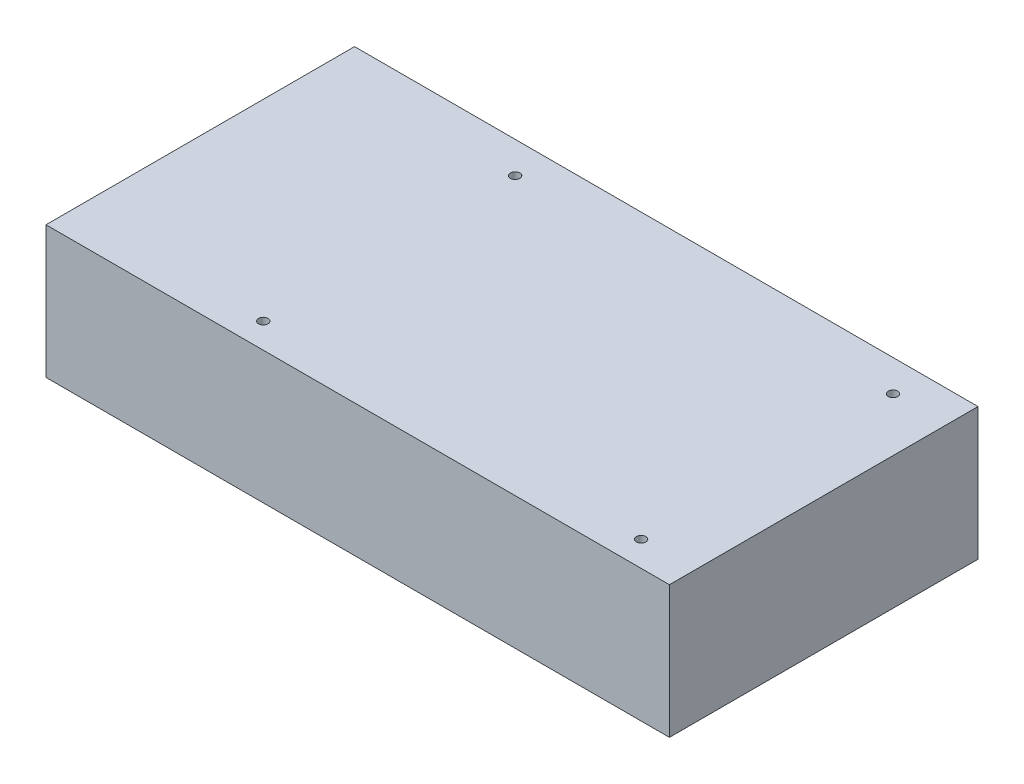
ISO-10303-21;
HEADER;
FILE_DESCRIPTION(('STEP AP214'),'2;1');
FILE_NAME('part.step','',(''),(''),'','','');
FILE_SCHEMA(('AUTOMOTIVE_DESIGN { 1 0 10303 214 1 1 1 1 }'));
ENDSEC;
DATA;
#1=APPLICATION_CONTEXT('core data for automotive mechanical design processes');
#2=APPLICATION_PROTOCOL_DEFINITION('international standard','automotive_design',2000,#1);
#3=PRODUCT_CONTEXT('',#1,'mechanical');
#4=PRODUCT('Part','Part','',(#3));
#5=PRODUCT_RELATED_PRODUCT_CATEGORY('part','',(#4));
#6=PRODUCT_DEFINITION_FORMATION('','',#4);
#7=PRODUCT_DEFINITION_CONTEXT('part definition',#1,'design');
#8=PRODUCT_DEFINITION('design','',#6,#7);
#9=PRODUCT_DEFINITION_SHAPE('','',#8);
#10=(LENGTH_UNIT() NAMED_UNIT(*) SI_UNIT(.MILLI.,.METRE.));
#11=(NAMED_UNIT(*) PLANE_ANGLE_UNIT() SI_UNIT($,.RADIAN.));
#12=(NAMED_UNIT(*) SI_UNIT($,.STERADIAN.) SOLID_ANGLE_UNIT());
#13=UNCERTAINTY_MEASURE_WITH_UNIT(LENGTH_MEASURE(1.E-05),#10,'distance_accuracy_value','');
#14=(GEOMETRIC_REPRESENTATION_CONTEXT(3) GLOBAL_UNCERTAINTY_ASSIGNED_CONTEXT((#13)) GLOBAL_UNIT_ASSIGNED_CONTEXT((#10,
#11,#12)) REPRESENTATION_CONTEXT('',''));
#15=CARTESIAN_POINT('',(0.,0.,0.));
#16=DIRECTION('',(0.,0.,1.));
#17=DIRECTION('',(1.,0.,0.));
#18=AXIS2_PLACEMENT_3D('',#15,#16,#17);
#19=CARTESIAN_POINT('',(0.,42.,0.));
#20=DIRECTION('',(1.,0.,0.));
#21=DIRECTION('',(0.,0.,-1.));
#22=AXIS2_PLACEMENT_3D('',#19,#20,#21);
#23=PLANE('',#22);
#24=DIRECTION('',(0.,0.,1.));
#25=VECTOR('',#24,1.);
#26=CARTESIAN_POINT('',(0.,0.,0.));
#27=LINE('',#26,#25);
#28=CARTESIAN_POINT('',(0.,0.,0.));
#29=VERTEX_POINT('',#28);
#30=CARTESIAN_POINT('',(0.,0.,98.));
#31=VERTEX_POINT('',#30);
#32=EDGE_CURVE('E106',#29,#31,#27,.T.);
#33=ORIENTED_EDGE('',*,*,#32,.T.);
#34=DIRECTION('',(0.,-1.,0.));
#35=VECTOR('',#34,1.);
#36=CARTESIAN_POINT('',(0.,42.,98.));
#37=LINE('',#36,#35);
#38=CARTESIAN_POINT('',(0.,42.,98.));
#39=VERTEX_POINT('',#38);
#40=EDGE_CURVE('E11',#39,#31,#37,.T.);
#41=ORIENTED_EDGE('',*,*,#40,.F.);
#42=DIRECTION('',(0.,0.,1.));
#43=VECTOR('',#42,1.);
#44=CARTESIAN_POINT('',(0.,42.,0.));
#45=LINE('',#44,#43);
#46=CARTESIAN_POINT('',(0.,42.,0.));
#47=VERTEX_POINT('',#46);
#48=EDGE_CURVE('E90',#47,#39,#45,.T.);
#49=ORIENTED_EDGE('',*,*,#48,.F.);
#50=DIRECTION('',(0.,-1.,0.));
#51=VECTOR('',#50,1.);
#52=CARTESIAN_POINT('',(0.,42.,0.));
#53=LINE('',#52,#51);
#54=EDGE_CURVE('E102',#47,#29,#53,.T.);
#55=ORIENTED_EDGE('',*,*,#54,.T.);
#56=EDGE_LOOP('',(#33,#41,#49,#55));
#57=FACE_BOUND('',#56,.T.);
#58=ADVANCED_FACE('F38',(#57),#23,.F.);
#59=CARTESIAN_POINT('',(0.,42.,98.));
#60=DIRECTION('',(0.,0.,-1.));
#61=DIRECTION('',(-1.,0.,0.));
#62=AXIS2_PLACEMENT_3D('',#59,#60,#61);
#63=PLANE('',#62);
#64=DIRECTION('',(1.,0.,0.));
#65=VECTOR('',#64,1.);
#66=CARTESIAN_POINT('',(0.,0.,98.));
#67=LINE('',#66,#65);
#68=CARTESIAN_POINT('',(198.,0.,98.));
#69=VERTEX_POINT('',#68);
#70=EDGE_CURVE('E95',#31,#69,#67,.T.);
#71=ORIENTED_EDGE('',*,*,#70,.T.);
#72=DIRECTION('',(0.,-1.,0.));
#73=VECTOR('',#72,1.);
#74=CARTESIAN_POINT('',(198.,42.,98.));
#75=LINE('',#74,#73);
#76=CARTESIAN_POINT('',(198.,42.,98.));
#77=VERTEX_POINT('',#76);
#78=EDGE_CURVE('E47',#77,#69,#75,.T.);
#79=ORIENTED_EDGE('',*,*,#78,.F.);
#80=DIRECTION('',(1.,0.,0.));
#81=VECTOR('',#80,1.);
#82=CARTESIAN_POINT('',(0.,42.,98.));
#83=LINE('',#82,#81);
#84=EDGE_CURVE('E85',#39,#77,#83,.T.);
#85=ORIENTED_EDGE('',*,*,#84,.F.);
#86=ORIENTED_EDGE('',*,*,#40,.T.);
#87=EDGE_LOOP('',(#71,#79,#85,#86));
#88=FACE_BOUND('',#87,.T.);
#89=ADVANCED_FACE('F94',(#88),#63,.F.);
#90=CARTESIAN_POINT('',(198.,42.,0.));
#91=DIRECTION('',(-1.,0.,0.));
#92=DIRECTION('',(0.,0.,1.));
#93=AXIS2_PLACEMENT_3D('',#90,#91,#92);
#94=PLANE('',#93);
#95=DIRECTION('',(0.,0.,-1.));
#96=VECTOR('',#95,1.);
#97=CARTESIAN_POINT('',(198.,0.,0.));
#98=LINE('',#97,#96);
#99=CARTESIAN_POINT('',(198.,0.,0.));
#100=VERTEX_POINT('',#99);
#101=EDGE_CURVE('E72',#69,#100,#98,.T.);
#102=ORIENTED_EDGE('',*,*,#101,.T.);
#103=DIRECTION('',(0.,-1.,0.));
#104=VECTOR('',#103,1.);
#105=CARTESIAN_POINT('',(198.,42.,0.));
#106=LINE('',#105,#104);
#107=CARTESIAN_POINT('',(198.,42.,0.));
#108=VERTEX_POINT('',#107);
#109=EDGE_CURVE('E97',#108,#100,#106,.T.);
#110=ORIENTED_EDGE('',*,*,#109,.F.);
#111=DIRECTION('',(0.,0.,-1.));
#112=VECTOR('',#111,1.);
#113=CARTESIAN_POINT('',(198.,42.,0.));
#114=LINE('',#113,#112);
#115=EDGE_CURVE('E88',#77,#108,#114,.T.);
#116=ORIENTED_EDGE('',*,*,#115,.F.);
#117=ORIENTED_EDGE('',*,*,#78,.T.);
#118=EDGE_LOOP('',(#102,#110,#116,#117));
#119=FACE_BOUND('',#118,.T.);
#120=ADVANCED_FACE('F98',(#119),#94,.F.);
#121=CARTESIAN_POINT('',(0.,42.,0.));
#122=DIRECTION('',(0.,0.,1.));
#123=DIRECTION('',(1.,0.,0.));
#124=AXIS2_PLACEMENT_3D('',#121,#122,#123);
#125=PLANE('',#124);
#126=DIRECTION('',(-1.,0.,0.));
#127=VECTOR('',#126,1.);
#128=CARTESIAN_POINT('',(0.,0.,0.));
#129=LINE('',#128,#127);
#130=EDGE_CURVE('E78',#100,#29,#129,.T.);
#131=ORIENTED_EDGE('',*,*,#130,.T.);
#132=ORIENTED_EDGE('',*,*,#54,.F.);
#133=DIRECTION('',(-1.,0.,0.));
#134=VECTOR('',#133,1.);
#135=CARTESIAN_POINT('',(0.,42.,0.));
#136=LINE('',#135,#134);
#137=EDGE_CURVE('E55',#108,#47,#136,.T.);
#138=ORIENTED_EDGE('',*,*,#137,.F.);
#139=ORIENTED_EDGE('',*,*,#109,.T.);
#140=EDGE_LOOP('',(#131,#132,#138,#139));
#141=FACE_BOUND('',#140,.T.);
#142=ADVANCED_FACE('F120',(#141),#125,.F.);
#143=CARTESIAN_POINT('',(0.,42.,0.));
#144=DIRECTION('',(0.,1.,0.));
#145=DIRECTION('',(0.,0.,1.));
#146=AXIS2_PLACEMENT_3D('',#143,#144,#145);
#147=PLANE('',#146);
#148=CARTESIAN_POINT('',(61.,42.,90.));
#149=DIRECTION('',(0.,1.,0.));
#150=DIRECTION('',(0.,0.,1.));
#151=AXIS2_PLACEMENT_3D('',#148,#149,#150);
#152=CIRCLE('',#151,1.5);
#153=CARTESIAN_POINT('',(61.,42.,91.5));
#154=VERTEX_POINT('',#153);
#155=EDGE_CURVE('E135',#154,#154,#152,.T.);
#156=ORIENTED_EDGE('',*,*,#155,.F.);
#157=EDGE_LOOP('',(#156));
#158=FACE_BOUND('',#157,.T.);
#159=CARTESIAN_POINT('',(181.,42.,90.));
#160=DIRECTION('',(0.,1.,0.));
#161=DIRECTION('',(0.,0.,1.));
#162=AXIS2_PLACEMENT_3D('',#159,#160,#161);
#163=CIRCLE('',#162,1.5);
#164=CARTESIAN_POINT('',(181.,42.,91.5));
#165=VERTEX_POINT('',#164);
#166=EDGE_CURVE('E144',#165,#165,#163,.T.);
#167=ORIENTED_EDGE('',*,*,#166,.F.);
#168=EDGE_LOOP('',(#167));
#169=FACE_BOUND('',#168,.T.);
#170=CARTESIAN_POINT('',(181.,42.,9.99999999999999));
#171=DIRECTION('',(0.,1.,0.));
#172=DIRECTION('',(0.,0.,1.));
#173=AXIS2_PLACEMENT_3D('',#170,#171,#172);
#174=CIRCLE('',#173,1.5);
#175=CARTESIAN_POINT('',(181.,42.,11.5));
#176=VERTEX_POINT('',#175);
#177=EDGE_CURVE('E152',#176,#176,#174,.T.);
#178=ORIENTED_EDGE('',*,*,#177,.F.);
#179=EDGE_LOOP('',(#178));
#180=FACE_BOUND('',#179,.T.);
#181=CARTESIAN_POINT('',(61.,42.,9.99999999999999));
#182=DIRECTION('',(0.,1.,0.));
#183=DIRECTION('',(0.,0.,1.));
#184=AXIS2_PLACEMENT_3D('',#181,#182,#183);
#185=CIRCLE('',#184,1.5);
#186=CARTESIAN_POINT('',(61.,42.,11.5));
#187=VERTEX_POINT('',#186);
#188=EDGE_CURVE('E127',#187,#187,#185,.T.);
#189=ORIENTED_EDGE('',*,*,#188,.F.);
#190=EDGE_LOOP('',(#189));
#191=FACE_BOUND('',#190,.T.);
#192=ORIENTED_EDGE('',*,*,#48,.T.);
#193=ORIENTED_EDGE('',*,*,#84,.T.);
#194=ORIENTED_EDGE('',*,*,#115,.T.);
#195=ORIENTED_EDGE('',*,*,#137,.T.);
#196=EDGE_LOOP('',(#192,#193,#194,#195));
#197=FACE_BOUND('',#196,.T.);
#198=ADVANCED_FACE('F86',(#158,#169,#180,#191,#197),#147,.T.);
#199=CARTESIAN_POINT('',(0.,0.,0.));
#200=DIRECTION('',(0.,1.,0.));
#201=DIRECTION('',(0.,0.,1.));
#202=AXIS2_PLACEMENT_3D('',#199,#200,#201);
#203=PLANE('',#202);
#204=CARTESIAN_POINT('',(153.,0.,35.));
#205=DIRECTION('',(0.,-1.,0.));
#206=DIRECTION('',(0.,0.,-1.));
#207=AXIS2_PLACEMENT_3D('',#204,#205,#206);
#208=CIRCLE('',#207,28.5);
#209=CARTESIAN_POINT('',(153.,0.,6.5));
#210=VERTEX_POINT('',#209);
#211=EDGE_CURVE('E159',#210,#210,#208,.T.);
#212=ORIENTED_EDGE('',*,*,#211,.F.);
#213=EDGE_LOOP('',(#212));
#214=FACE_BOUND('',#213,.T.);
#215=ORIENTED_EDGE('',*,*,#32,.F.);
#216=ORIENTED_EDGE('',*,*,#130,.F.);
#217=ORIENTED_EDGE('',*,*,#101,.F.);
#218=ORIENTED_EDGE('',*,*,#70,.F.);
#219=EDGE_LOOP('',(#215,#216,#217,#218));
#220=FACE_BOUND('',#219,.T.);
#221=ADVANCED_FACE('F123',(#214,#220),#203,.F.);
#222=CARTESIAN_POINT('',(61.,39.,9.99999999999999));
#223=DIRECTION('',(0.,1.,0.));
#224=DIRECTION('',(0.,0.,1.));
#225=AXIS2_PLACEMENT_3D('',#222,#223,#224);
#226=CYLINDRICAL_SURFACE('',#225,1.5);
#227=CARTESIAN_POINT('',(61.,39.,9.99999999999999));
#228=DIRECTION('',(0.,1.,0.));
#229=DIRECTION('',(0.,0.,1.));
#230=AXIS2_PLACEMENT_3D('',#227,#228,#229);
#231=CIRCLE('',#230,1.5);
#232=CARTESIAN_POINT('',(61.,39.,11.5));
#233=VERTEX_POINT('',#232);
#234=EDGE_CURVE('E110',#233,#233,#231,.T.);
#235=ORIENTED_EDGE('',*,*,#234,.F.);
#236=EDGE_LOOP('',(#235));
#237=FACE_BOUND('',#236,.T.);
#238=ORIENTED_EDGE('',*,*,#188,.T.);
#239=EDGE_LOOP('',(#238));
#240=FACE_BOUND('',#239,.T.);
#241=ADVANCED_FACE('F192',(#237,#240),#226,.F.);
#242=CARTESIAN_POINT('',(61.,39.,9.99999999999999));
#243=DIRECTION('',(0.,1.,0.));
#244=DIRECTION('',(0.,0.,1.));
#245=AXIS2_PLACEMENT_3D('',#242,#243,#244);
#246=PLANE('',#245);
#247=ORIENTED_EDGE('',*,*,#234,.T.);
#248=EDGE_LOOP('',(#247));
#249=FACE_BOUND('',#248,.T.);
#250=ADVANCED_FACE('F199',(#249),#246,.T.);
#251=CARTESIAN_POINT('',(181.,39.,9.99999999999999));
#252=DIRECTION('',(0.,1.,0.));
#253=DIRECTION('',(0.,0.,1.));
#254=AXIS2_PLACEMENT_3D('',#251,#252,#253);
#255=CYLINDRICAL_SURFACE('',#254,1.5);
#256=CARTESIAN_POINT('',(181.,39.,9.99999999999999));
#257=DIRECTION('',(0.,1.,0.));
#258=DIRECTION('',(0.,0.,1.));
#259=AXIS2_PLACEMENT_3D('',#256,#257,#258);
#260=CIRCLE('',#259,1.5);
#261=CARTESIAN_POINT('',(181.,39.,11.5));
#262=VERTEX_POINT('',#261);
#263=EDGE_CURVE('E131',#262,#262,#260,.T.);
#264=ORIENTED_EDGE('',*,*,#263,.F.);
#265=EDGE_LOOP('',(#264));
#266=FACE_BOUND('',#265,.T.);
#267=ORIENTED_EDGE('',*,*,#177,.T.);
#268=EDGE_LOOP('',(#267));
#269=FACE_BOUND('',#268,.T.);
#270=ADVANCED_FACE('F240',(#266,#269),#255,.F.);
#271=CARTESIAN_POINT('',(181.,39.,9.99999999999999));
#272=DIRECTION('',(0.,1.,0.));
#273=DIRECTION('',(0.,0.,1.));
#274=AXIS2_PLACEMENT_3D('',#271,#272,#273);
#275=PLANE('',#274);
#276=ORIENTED_EDGE('',*,*,#263,.T.);
#277=EDGE_LOOP('',(#276));
#278=FACE_BOUND('',#277,.T.);
#279=ADVANCED_FACE('F250',(#278),#275,.T.);
#280=CARTESIAN_POINT('',(181.,39.,90.));
#281=DIRECTION('',(0.,1.,0.));
#282=DIRECTION('',(0.,0.,1.));
#283=AXIS2_PLACEMENT_3D('',#280,#281,#282);
#284=CYLINDRICAL_SURFACE('',#283,1.5);
#285=CARTESIAN_POINT('',(181.,39.,90.));
#286=DIRECTION('',(0.,1.,0.));
#287=DIRECTION('',(0.,0.,1.));
#288=AXIS2_PLACEMENT_3D('',#285,#286,#287);
#289=CIRCLE('',#288,1.5);
#290=CARTESIAN_POINT('',(181.,39.,91.5));
#291=VERTEX_POINT('',#290);
#292=EDGE_CURVE('E148',#291,#291,#289,.T.);
#293=ORIENTED_EDGE('',*,*,#292,.F.);
#294=EDGE_LOOP('',(#293));
#295=FACE_BOUND('',#294,.T.);
#296=ORIENTED_EDGE('',*,*,#166,.T.);
#297=EDGE_LOOP('',(#296));
#298=FACE_BOUND('',#297,.T.);
#299=ADVANCED_FACE('F260',(#295,#298),#284,.F.);
#300=CARTESIAN_POINT('',(181.,39.,90.));
#301=DIRECTION('',(0.,1.,0.));
#302=DIRECTION('',(0.,0.,1.));
#303=AXIS2_PLACEMENT_3D('',#300,#301,#302);
#304=PLANE('',#303);
#305=ORIENTED_EDGE('',*,*,#292,.T.);
#306=EDGE_LOOP('',(#305));
#307=FACE_BOUND('',#306,.T.);
#308=ADVANCED_FACE('F270',(#307),#304,.T.);
#309=CARTESIAN_POINT('',(61.,39.,90.));
#310=DIRECTION('',(0.,1.,0.));
#311=DIRECTION('',(0.,0.,1.));
#312=AXIS2_PLACEMENT_3D('',#309,#310,#311);
#313=CYLINDRICAL_SURFACE('',#312,1.5);
#314=CARTESIAN_POINT('',(61.,39.,90.));
#315=DIRECTION('',(0.,1.,0.));
#316=DIRECTION('',(0.,0.,1.));
#317=AXIS2_PLACEMENT_3D('',#314,#315,#316);
#318=CIRCLE('',#317,1.5);
#319=CARTESIAN_POINT('',(61.,39.,91.5));
#320=VERTEX_POINT('',#319);
#321=EDGE_CURVE('E139',#320,#320,#318,.T.);
#322=ORIENTED_EDGE('',*,*,#321,.F.);
#323=EDGE_LOOP('',(#322));
#324=FACE_BOUND('',#323,.T.);
#325=ORIENTED_EDGE('',*,*,#155,.T.);
#326=EDGE_LOOP('',(#325));
#327=FACE_BOUND('',#326,.T.);
#328=ADVANCED_FACE('F280',(#324,#327),#313,.F.);
#329=CARTESIAN_POINT('',(61.,39.,90.));
#330=DIRECTION('',(0.,1.,0.));
#331=DIRECTION('',(0.,0.,1.));
#332=AXIS2_PLACEMENT_3D('',#329,#330,#331);
#333=PLANE('',#332);
#334=ORIENTED_EDGE('',*,*,#321,.T.);
#335=EDGE_LOOP('',(#334));
#336=FACE_BOUND('',#335,.T.);
#337=ADVANCED_FACE('F187',(#336),#333,.T.);
#338=CARTESIAN_POINT('',(153.,2.,35.));
#339=DIRECTION('',(0.,-1.,0.));
#340=DIRECTION('',(0.,0.,-1.));
#341=AXIS2_PLACEMENT_3D('',#338,#339,#340);
#342=CYLINDRICAL_SURFACE('',#341,28.5);
#343=CARTESIAN_POINT('',(153.,2.,35.));
#344=DIRECTION('',(0.,-1.,0.));
#345=DIRECTION('',(0.,0.,-1.));
#346=AXIS2_PLACEMENT_3D('',#343,#344,#345);
#347=CIRCLE('',#346,28.5);
#348=CARTESIAN_POINT('',(153.,2.,6.5));
#349=VERTEX_POINT('',#348);
#350=EDGE_CURVE('E140',#349,#349,#347,.T.);
#351=ORIENTED_EDGE('',*,*,#350,.F.);
#352=EDGE_LOOP('',(#351));
#353=FACE_BOUND('',#352,.T.);
#354=ORIENTED_EDGE('',*,*,#211,.T.);
#355=EDGE_LOOP('',(#354));
#356=FACE_BOUND('',#355,.T.);
#357=ADVANCED_FACE('F181',(#353,#356),#342,.F.);
#358=CARTESIAN_POINT('',(153.,2.,35.));
#359=DIRECTION('',(0.,-1.,0.));
#360=DIRECTION('',(0.,0.,-1.));
#361=AXIS2_PLACEMENT_3D('',#358,#359,#360);
#362=PLANE('',#361);
#363=CARTESIAN_POINT('',(153.,2.,35.));
#364=DIRECTION('',(0.,-1.,0.));
#365=DIRECTION('',(0.,0.,-1.));
#366=AXIS2_PLACEMENT_3D('',#363,#364,#365);
#367=CIRCLE('',#366,4.99999999999999);
#368=CARTESIAN_POINT('',(153.,2.,30.));
#369=VERTEX_POINT('',#368);
#370=EDGE_CURVE('E163',#369,#369,#367,.T.);
#371=ORIENTED_EDGE('',*,*,#370,.F.);
#372=EDGE_LOOP('',(#371));
#373=FACE_BOUND('',#372,.T.);
#374=ORIENTED_EDGE('',*,*,#350,.T.);
#375=EDGE_LOOP('',(#374));
#376=FACE_BOUND('',#375,.T.);
#377=ADVANCED_FACE('F178',(#373,#376),#362,.T.);
#378=CARTESIAN_POINT('',(153.,2.,35.));
#379=DIRECTION('',(0.,-1.,0.));
#380=DIRECTION('',(0.,0.,-1.));
#381=AXIS2_PLACEMENT_3D('',#378,#379,#380);
#382=CYLINDRICAL_SURFACE('',#381,4.99999999999999);
#383=ORIENTED_EDGE('',*,*,#370,.T.);
#384=EDGE_LOOP('',(#383));
#385=FACE_BOUND('',#384,.T.);
#386=CARTESIAN_POINT('',(153.,0.,35.));
#387=DIRECTION('',(0.,-1.,0.));
#388=DIRECTION('',(0.,0.,-1.));
#389=AXIS2_PLACEMENT_3D('',#386,#387,#388);
#390=CIRCLE('',#389,4.99999999999999);
#391=CARTESIAN_POINT('',(153.,0.,30.));
#392=VERTEX_POINT('',#391);
#393=EDGE_CURVE('E167',#392,#392,#390,.T.);
#394=ORIENTED_EDGE('',*,*,#393,.F.);
#395=EDGE_LOOP('',(#394));
#396=FACE_BOUND('',#395,.T.);
#397=ADVANCED_FACE('F175',(#385,#396),#382,.T.);
#398=ORIENTED_EDGE('',*,*,#393,.T.);
#399=EDGE_LOOP('',(#398));
#400=FACE_BOUND('',#399,.T.);
#401=ADVANCED_FACE('F194',(#400),#203,.F.);
#402=CLOSED_SHELL('',(#58,#89,#120,#142,#198,#221,#241,#250,#270,#279,#299,#308,#328,#337,#357,
#377,#397,#401));
#403=MANIFOLD_SOLID_BREP('B2',#402);
#404=ADVANCED_BREP_SHAPE_REPRESENTATION('',(#18,#403),#14);
#405=SHAPE_DEFINITION_REPRESENTATION(#9,#404);
ENDSEC;
END-ISO-10303-21;
